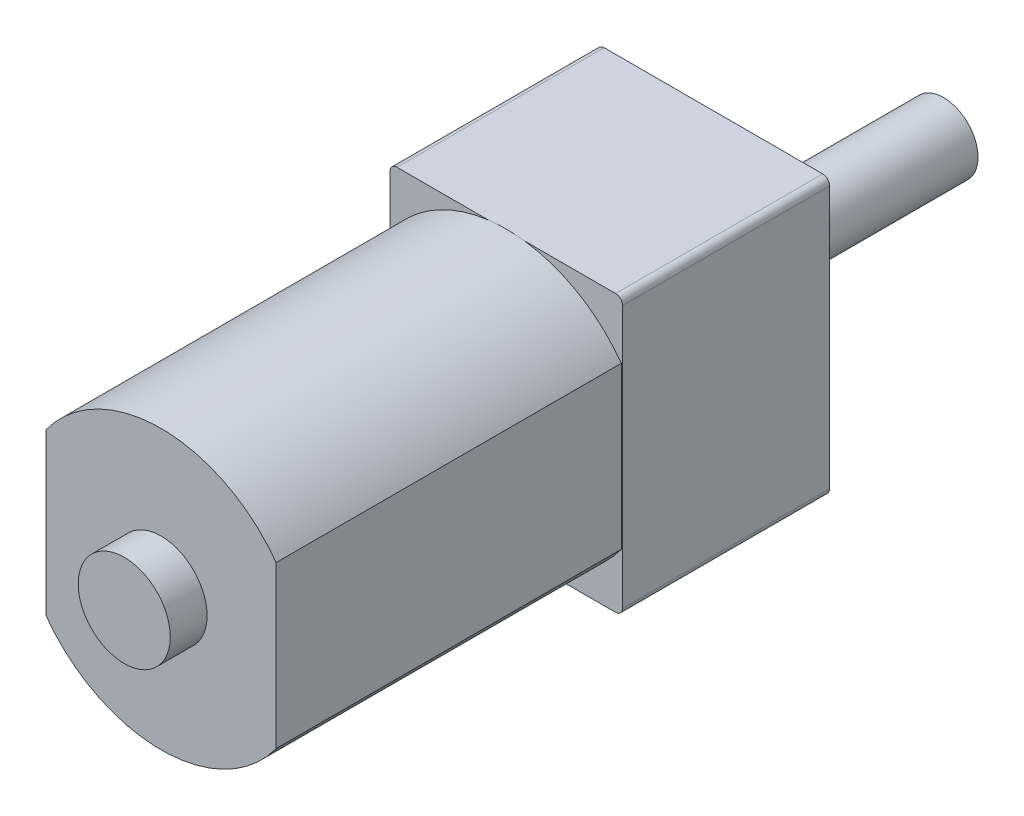
ISO-10303-21;
HEADER;
FILE_DESCRIPTION(('STEP AP214'),'2;1');
FILE_NAME('part.step','',(''),(''),'','','');
FILE_SCHEMA(('AUTOMOTIVE_DESIGN { 1 0 10303 214 1 1 1 1 }'));
ENDSEC;
DATA;
#1=APPLICATION_CONTEXT('core data for automotive mechanical design processes');
#2=APPLICATION_PROTOCOL_DEFINITION('international standard','automotive_design',2000,#1);
#3=PRODUCT_CONTEXT('',#1,'mechanical');
#4=PRODUCT('Part','Part','',(#3));
#5=PRODUCT_RELATED_PRODUCT_CATEGORY('part','',(#4));
#6=PRODUCT_DEFINITION_FORMATION('','',#4);
#7=PRODUCT_DEFINITION_CONTEXT('part definition',#1,'design');
#8=PRODUCT_DEFINITION('design','',#6,#7);
#9=PRODUCT_DEFINITION_SHAPE('','',#8);
#10=(LENGTH_UNIT() NAMED_UNIT(*) SI_UNIT(.MILLI.,.METRE.));
#11=(NAMED_UNIT(*) PLANE_ANGLE_UNIT() SI_UNIT($,.RADIAN.));
#12=(NAMED_UNIT(*) SI_UNIT($,.STERADIAN.) SOLID_ANGLE_UNIT());
#13=UNCERTAINTY_MEASURE_WITH_UNIT(LENGTH_MEASURE(1.E-05),#10,'distance_accuracy_value','');
#14=(GEOMETRIC_REPRESENTATION_CONTEXT(3) GLOBAL_UNCERTAINTY_ASSIGNED_CONTEXT((#13)) GLOBAL_UNIT_ASSIGNED_CONTEXT((#10,
#11,#12)) REPRESENTATION_CONTEXT('',''));
#15=CARTESIAN_POINT('',(0.,0.,0.));
#16=DIRECTION('',(0.,0.,1.));
#17=DIRECTION('',(1.,0.,0.));
#18=AXIS2_PLACEMENT_3D('',#15,#16,#17);
#19=CARTESIAN_POINT('',(0.,-0.126960784313727,0.));
#20=DIRECTION('',(0.,0.,-1.));
#21=DIRECTION('',(-1.,0.,0.));
#22=AXIS2_PLACEMENT_3D('',#19,#20,#21);
#23=PLANE('',#22);
#24=DIRECTION('',(1.,0.,0.));
#25=VECTOR('',#24,1.);
#26=CARTESIAN_POINT('',(-5.05,6.,0.));
#27=LINE('',#26,#25);
#28=CARTESIAN_POINT('',(-0.784344362146735,6.,0.));
#29=VERTEX_POINT('',#28);
#30=CARTESIAN_POINT('',(0.784344362146738,6.,0.));
#31=VERTEX_POINT('',#30);
#32=EDGE_CURVE('E159',#29,#31,#27,.T.);
#33=ORIENTED_EDGE('',*,*,#32,.F.);
#34=CARTESIAN_POINT('',(0.,-0.126960784313727,0.));
#35=DIRECTION('',(0.,0.,1.));
#36=DIRECTION('',(-1.,0.,0.));
#37=AXIS2_PLACEMENT_3D('',#34,#35,#36);
#38=CIRCLE('',#37,6.17696078431373);
#39=EDGE_CURVE('E217',#31,#29,#38,.T.);
#40=ORIENTED_EDGE('',*,*,#39,.F.);
#41=EDGE_LOOP('',(#33,#40));
#42=FACE_BOUND('',#41,.T.);
#43=ADVANCED_FACE('F38',(#42),#23,.T.);
#44=CARTESIAN_POINT('',(0.,-0.126960784313727,15.));
#45=DIRECTION('',(0.,0.,-1.));
#46=DIRECTION('',(-1.,0.,0.));
#47=AXIS2_PLACEMENT_3D('',#44,#45,#46);
#48=CYLINDRICAL_SURFACE('',#47,6.17696078431373);
#49=CARTESIAN_POINT('',(5.,3.5,0.));
#50=VERTEX_POINT('',#49);
#51=EDGE_CURVE('E213',#50,#31,#38,.T.);
#52=ORIENTED_EDGE('',*,*,#51,.T.);
#53=ORIENTED_EDGE('',*,*,#39,.T.);
#54=CARTESIAN_POINT('',(-5.,3.5,0.));
#55=VERTEX_POINT('',#54);
#56=EDGE_CURVE('E193',#29,#55,#38,.T.);
#57=ORIENTED_EDGE('',*,*,#56,.T.);
#58=DIRECTION('',(0.,0.,-1.));
#59=VECTOR('',#58,1.);
#60=CARTESIAN_POINT('',(-5.,3.5,15.));
#61=LINE('',#60,#59);
#62=CARTESIAN_POINT('',(-5.,3.5,15.));
#63=VERTEX_POINT('',#62);
#64=EDGE_CURVE('E232',#63,#55,#61,.T.);
#65=ORIENTED_EDGE('',*,*,#64,.F.);
#66=CARTESIAN_POINT('',(0.,-0.126960784313727,15.));
#67=DIRECTION('',(0.,0.,1.));
#68=DIRECTION('',(-1.,0.,0.));
#69=AXIS2_PLACEMENT_3D('',#66,#67,#68);
#70=CIRCLE('',#69,6.17696078431373);
#71=CARTESIAN_POINT('',(5.,3.5,15.));
#72=VERTEX_POINT('',#71);
#73=EDGE_CURVE('E202',#72,#63,#70,.T.);
#74=ORIENTED_EDGE('',*,*,#73,.F.);
#75=DIRECTION('',(0.,0.,-1.));
#76=VECTOR('',#75,1.);
#77=CARTESIAN_POINT('',(5.,3.5,15.));
#78=LINE('',#77,#76);
#79=EDGE_CURVE('E212',#72,#50,#78,.T.);
#80=ORIENTED_EDGE('',*,*,#79,.T.);
#81=EDGE_LOOP('',(#52,#53,#57,#65,#74,#80));
#82=FACE_BOUND('',#81,.T.);
#83=ADVANCED_FACE('F278',(#82),#48,.T.);
#84=CARTESIAN_POINT('',(-5.,-3.5,15.));
#85=DIRECTION('',(1.,0.,0.));
#86=DIRECTION('',(0.,1.,0.));
#87=AXIS2_PLACEMENT_3D('',#84,#85,#86);
#88=PLANE('',#87);
#89=DIRECTION('',(0.,-1.,0.));
#90=VECTOR('',#89,1.);
#91=CARTESIAN_POINT('',(-5.,-3.5,0.));
#92=LINE('',#91,#90);
#93=CARTESIAN_POINT('',(-5.,-3.5,0.));
#94=VERTEX_POINT('',#93);
#95=EDGE_CURVE('E216',#55,#94,#92,.T.);
#96=ORIENTED_EDGE('',*,*,#95,.T.);
#97=DIRECTION('',(0.,0.,-1.));
#98=VECTOR('',#97,1.);
#99=CARTESIAN_POINT('',(-5.,-3.5,15.));
#100=LINE('',#99,#98);
#101=CARTESIAN_POINT('',(-5.,-3.5,15.));
#102=VERTEX_POINT('',#101);
#103=EDGE_CURVE('E229',#102,#94,#100,.T.);
#104=ORIENTED_EDGE('',*,*,#103,.F.);
#105=DIRECTION('',(0.,-1.,0.));
#106=VECTOR('',#105,1.);
#107=CARTESIAN_POINT('',(-5.,-3.5,15.));
#108=LINE('',#107,#106);
#109=EDGE_CURVE('E205',#63,#102,#108,.T.);
#110=ORIENTED_EDGE('',*,*,#109,.F.);
#111=ORIENTED_EDGE('',*,*,#64,.T.);
#112=EDGE_LOOP('',(#96,#104,#110,#111));
#113=FACE_BOUND('',#112,.T.);
#114=ADVANCED_FACE('F324',(#113),#88,.F.);
#115=CARTESIAN_POINT('',(0.,0.126960784313726,15.));
#116=DIRECTION('',(0.,0.,-1.));
#117=DIRECTION('',(-1.,0.,0.));
#118=AXIS2_PLACEMENT_3D('',#115,#116,#117);
#119=CYLINDRICAL_SURFACE('',#118,6.17696078431373);
#120=CARTESIAN_POINT('',(0.,0.126960784313726,0.));
#121=DIRECTION('',(0.,0.,1.));
#122=DIRECTION('',(-1.,0.,0.));
#123=AXIS2_PLACEMENT_3D('',#120,#121,#122);
#124=CIRCLE('',#123,6.17696078431373);
#125=CARTESIAN_POINT('',(-0.784344362146725,-6.,0.));
#126=VERTEX_POINT('',#125);
#127=EDGE_CURVE('E220',#94,#126,#124,.T.);
#128=ORIENTED_EDGE('',*,*,#127,.T.);
#129=CARTESIAN_POINT('',(0.784344362146723,-6.,0.));
#130=VERTEX_POINT('',#129);
#131=EDGE_CURVE('E222',#126,#130,#124,.T.);
#132=ORIENTED_EDGE('',*,*,#131,.T.);
#133=CARTESIAN_POINT('',(5.,-3.5,0.));
#134=VERTEX_POINT('',#133);
#135=EDGE_CURVE('E219',#130,#134,#124,.T.);
#136=ORIENTED_EDGE('',*,*,#135,.T.);
#137=DIRECTION('',(0.,0.,-1.));
#138=VECTOR('',#137,1.);
#139=CARTESIAN_POINT('',(5.,-3.5,15.));
#140=LINE('',#139,#138);
#141=CARTESIAN_POINT('',(5.,-3.5,15.));
#142=VERTEX_POINT('',#141);
#143=EDGE_CURVE('E226',#142,#134,#140,.T.);
#144=ORIENTED_EDGE('',*,*,#143,.F.);
#145=CARTESIAN_POINT('',(0.,0.126960784313726,15.));
#146=DIRECTION('',(0.,0.,1.));
#147=DIRECTION('',(-1.,0.,0.));
#148=AXIS2_PLACEMENT_3D('',#145,#146,#147);
#149=CIRCLE('',#148,6.17696078431373);
#150=EDGE_CURVE('E208',#102,#142,#149,.T.);
#151=ORIENTED_EDGE('',*,*,#150,.F.);
#152=ORIENTED_EDGE('',*,*,#103,.T.);
#153=EDGE_LOOP('',(#128,#132,#136,#144,#151,#152));
#154=FACE_BOUND('',#153,.T.);
#155=ADVANCED_FACE('F344',(#154),#119,.T.);
#156=CARTESIAN_POINT('',(5.,-3.5,15.));
#157=DIRECTION('',(-1.,0.,0.));
#158=DIRECTION('',(0.,-1.,0.));
#159=AXIS2_PLACEMENT_3D('',#156,#157,#158);
#160=PLANE('',#159);
#161=DIRECTION('',(0.,1.,0.));
#162=VECTOR('',#161,1.);
#163=CARTESIAN_POINT('',(5.,-3.5,0.));
#164=LINE('',#163,#162);
#165=EDGE_CURVE('E206',#134,#50,#164,.T.);
#166=ORIENTED_EDGE('',*,*,#165,.T.);
#167=ORIENTED_EDGE('',*,*,#79,.F.);
#168=DIRECTION('',(0.,1.,0.));
#169=VECTOR('',#168,1.);
#170=CARTESIAN_POINT('',(5.,-3.5,15.));
#171=LINE('',#170,#169);
#172=EDGE_CURVE('E210',#142,#72,#171,.T.);
#173=ORIENTED_EDGE('',*,*,#172,.F.);
#174=ORIENTED_EDGE('',*,*,#143,.T.);
#175=EDGE_LOOP('',(#166,#167,#173,#174));
#176=FACE_BOUND('',#175,.T.);
#177=ADVANCED_FACE('F337',(#176),#160,.F.);
#178=CARTESIAN_POINT('',(0.,-0.126960784313727,15.));
#179=DIRECTION('',(0.,0.,-1.));
#180=DIRECTION('',(-1.,0.,0.));
#181=AXIS2_PLACEMENT_3D('',#178,#179,#180);
#182=PLANE('',#181);
#183=CARTESIAN_POINT('',(0.,0.,15.));
#184=DIRECTION('',(0.,0.,1.));
#185=DIRECTION('',(1.,0.,0.));
#186=AXIS2_PLACEMENT_3D('',#183,#184,#185);
#187=CIRCLE('',#186,2.);
#188=CARTESIAN_POINT('',(2.,0.,15.));
#189=VERTEX_POINT('',#188);
#190=EDGE_CURVE('E158',#189,#189,#187,.T.);
#191=ORIENTED_EDGE('',*,*,#190,.F.);
#192=EDGE_LOOP('',(#191));
#193=FACE_BOUND('',#192,.T.);
#194=ORIENTED_EDGE('',*,*,#73,.T.);
#195=ORIENTED_EDGE('',*,*,#109,.T.);
#196=ORIENTED_EDGE('',*,*,#150,.T.);
#197=ORIENTED_EDGE('',*,*,#172,.T.);
#198=EDGE_LOOP('',(#194,#195,#196,#197));
#199=FACE_BOUND('',#198,.T.);
#200=ADVANCED_FACE('F330',(#193,#199),#182,.F.);
#201=DIRECTION('',(-1.,0.,0.));
#202=VECTOR('',#201,1.);
#203=CARTESIAN_POINT('',(-5.05,-6.,0.));
#204=LINE('',#203,#202);
#205=EDGE_CURVE('E198',#130,#126,#204,.T.);
#206=ORIENTED_EDGE('',*,*,#205,.F.);
#207=ORIENTED_EDGE('',*,*,#131,.F.);
#208=EDGE_LOOP('',(#206,#207));
#209=FACE_BOUND('',#208,.T.);
#210=ADVANCED_FACE('F320',(#209),#23,.T.);
#211=CARTESIAN_POINT('',(0.,0.,0.));
#212=DIRECTION('',(0.,0.,-1.));
#213=DIRECTION('',(-1.,0.,0.));
#214=AXIS2_PLACEMENT_3D('',#211,#212,#213);
#215=PLANE('',#214);
#216=CARTESIAN_POINT('',(4.75,-6.,0.));
#217=VERTEX_POINT('',#216);
#218=EDGE_CURVE('E195',#217,#130,#204,.T.);
#219=ORIENTED_EDGE('',*,*,#218,.F.);
#220=CARTESIAN_POINT('',(4.75,-5.7,0.));
#221=DIRECTION('',(0.,0.,-1.));
#222=DIRECTION('',(-1.,0.,0.));
#223=AXIS2_PLACEMENT_3D('',#220,#221,#222);
#224=CIRCLE('',#223,0.3);
#225=CARTESIAN_POINT('',(5.05,-5.7,0.));
#226=VERTEX_POINT('',#225);
#227=EDGE_CURVE('E242',#217,#226,#224,.F.);
#228=ORIENTED_EDGE('',*,*,#227,.T.);
#229=DIRECTION('',(0.,-1.,0.));
#230=VECTOR('',#229,1.);
#231=CARTESIAN_POINT('',(5.05,-6.,0.));
#232=LINE('',#231,#230);
#233=CARTESIAN_POINT('',(5.05,5.7,0.));
#234=VERTEX_POINT('',#233);
#235=EDGE_CURVE('E173',#234,#226,#232,.T.);
#236=ORIENTED_EDGE('',*,*,#235,.F.);
#237=CARTESIAN_POINT('',(4.75,5.7,0.));
#238=DIRECTION('',(0.,0.,-1.));
#239=DIRECTION('',(-1.,0.,0.));
#240=AXIS2_PLACEMENT_3D('',#237,#238,#239);
#241=CIRCLE('',#240,0.3);
#242=CARTESIAN_POINT('',(4.75,6.,0.));
#243=VERTEX_POINT('',#242);
#244=EDGE_CURVE('E240',#234,#243,#241,.F.);
#245=ORIENTED_EDGE('',*,*,#244,.T.);
#246=EDGE_CURVE('E200',#31,#243,#27,.T.);
#247=ORIENTED_EDGE('',*,*,#246,.F.);
#248=ORIENTED_EDGE('',*,*,#51,.F.);
#249=ORIENTED_EDGE('',*,*,#165,.F.);
#250=ORIENTED_EDGE('',*,*,#135,.F.);
#251=EDGE_LOOP('',(#219,#228,#236,#245,#247,#248,#249,#250));
#252=FACE_BOUND('',#251,.T.);
#253=ADVANCED_FACE('F329',(#252),#215,.F.);
#254=CARTESIAN_POINT('',(5.05,-6.,-9.));
#255=DIRECTION('',(-1.,0.,0.));
#256=DIRECTION('',(0.,0.,1.));
#257=AXIS2_PLACEMENT_3D('',#254,#255,#256);
#258=PLANE('',#257);
#259=ORIENTED_EDGE('',*,*,#235,.T.);
#260=DIRECTION('',(0.,0.,1.));
#261=VECTOR('',#260,1.);
#262=CARTESIAN_POINT('',(5.05,-5.7,-9.));
#263=LINE('',#262,#261);
#264=CARTESIAN_POINT('',(5.05,-5.7,-9.));
#265=VERTEX_POINT('',#264);
#266=EDGE_CURVE('E247',#226,#265,#263,.F.);
#267=ORIENTED_EDGE('',*,*,#266,.T.);
#268=DIRECTION('',(0.,-1.,0.));
#269=VECTOR('',#268,1.);
#270=CARTESIAN_POINT('',(5.05,-6.,-9.));
#271=LINE('',#270,#269);
#272=CARTESIAN_POINT('',(5.05,5.7,-9.));
#273=VERTEX_POINT('',#272);
#274=EDGE_CURVE('E181',#273,#265,#271,.T.);
#275=ORIENTED_EDGE('',*,*,#274,.F.);
#276=DIRECTION('',(0.,0.,1.));
#277=VECTOR('',#276,1.);
#278=CARTESIAN_POINT('',(5.05,5.7,-9.));
#279=LINE('',#278,#277);
#280=EDGE_CURVE('E244',#273,#234,#279,.T.);
#281=ORIENTED_EDGE('',*,*,#280,.T.);
#282=EDGE_LOOP('',(#259,#267,#275,#281));
#283=FACE_BOUND('',#282,.T.);
#284=ADVANCED_FACE('F294',(#283),#258,.F.);
#285=CARTESIAN_POINT('',(-5.05,-6.,-9.));
#286=DIRECTION('',(0.,1.,0.));
#287=DIRECTION('',(-1.,0.,0.));
#288=AXIS2_PLACEMENT_3D('',#285,#286,#287);
#289=PLANE('',#288);
#290=DIRECTION('',(-1.,0.,0.));
#291=VECTOR('',#290,1.);
#292=CARTESIAN_POINT('',(-5.05,-6.,-9.));
#293=LINE('',#292,#291);
#294=CARTESIAN_POINT('',(4.75,-6.,-9.));
#295=VERTEX_POINT('',#294);
#296=CARTESIAN_POINT('',(-4.75,-6.,-9.));
#297=VERTEX_POINT('',#296);
#298=EDGE_CURVE('E184',#295,#297,#293,.T.);
#299=ORIENTED_EDGE('',*,*,#298,.F.);
#300=DIRECTION('',(0.,0.,1.));
#301=VECTOR('',#300,1.);
#302=CARTESIAN_POINT('',(4.75,-6.,-9.));
#303=LINE('',#302,#301);
#304=EDGE_CURVE('E237',#295,#217,#303,.T.);
#305=ORIENTED_EDGE('',*,*,#304,.T.);
#306=ORIENTED_EDGE('',*,*,#218,.T.);
#307=ORIENTED_EDGE('',*,*,#205,.T.);
#308=CARTESIAN_POINT('',(-4.75,-6.,0.));
#309=VERTEX_POINT('',#308);
#310=EDGE_CURVE('E176',#126,#309,#204,.T.);
#311=ORIENTED_EDGE('',*,*,#310,.T.);
#312=DIRECTION('',(0.,0.,1.));
#313=VECTOR('',#312,1.);
#314=CARTESIAN_POINT('',(-4.75,-6.,-9.));
#315=LINE('',#314,#313);
#316=EDGE_CURVE('E235',#309,#297,#315,.F.);
#317=ORIENTED_EDGE('',*,*,#316,.T.);
#318=EDGE_LOOP('',(#299,#305,#306,#307,#311,#317));
#319=FACE_BOUND('',#318,.T.);
#320=ADVANCED_FACE('F303',(#319),#289,.F.);
#321=CARTESIAN_POINT('',(-5.05,-6.,-9.));
#322=DIRECTION('',(1.,0.,0.));
#323=DIRECTION('',(0.,0.,-1.));
#324=AXIS2_PLACEMENT_3D('',#321,#322,#323);
#325=PLANE('',#324);
#326=DIRECTION('',(0.,1.,0.));
#327=VECTOR('',#326,1.);
#328=CARTESIAN_POINT('',(-5.05,-6.,-9.));
#329=LINE('',#328,#327);
#330=CARTESIAN_POINT('',(-5.05,-5.7,-9.));
#331=VERTEX_POINT('',#330);
#332=CARTESIAN_POINT('',(-5.05,5.7,-9.));
#333=VERTEX_POINT('',#332);
#334=EDGE_CURVE('E188',#331,#333,#329,.T.);
#335=ORIENTED_EDGE('',*,*,#334,.F.);
#336=DIRECTION('',(0.,0.,1.));
#337=VECTOR('',#336,1.);
#338=CARTESIAN_POINT('',(-5.05,-5.7,-9.));
#339=LINE('',#338,#337);
#340=CARTESIAN_POINT('',(-5.05,-5.7,0.));
#341=VERTEX_POINT('',#340);
#342=EDGE_CURVE('E259',#331,#341,#339,.T.);
#343=ORIENTED_EDGE('',*,*,#342,.T.);
#344=DIRECTION('',(0.,1.,0.));
#345=VECTOR('',#344,1.);
#346=CARTESIAN_POINT('',(-5.05,-6.,0.));
#347=LINE('',#346,#345);
#348=CARTESIAN_POINT('',(-5.05,5.7,0.));
#349=VERTEX_POINT('',#348);
#350=EDGE_CURVE('E197',#341,#349,#347,.T.);
#351=ORIENTED_EDGE('',*,*,#350,.T.);
#352=DIRECTION('',(0.,0.,1.));
#353=VECTOR('',#352,1.);
#354=CARTESIAN_POINT('',(-5.05,5.7,-9.));
#355=LINE('',#354,#353);
#356=EDGE_CURVE('E257',#349,#333,#355,.F.);
#357=ORIENTED_EDGE('',*,*,#356,.T.);
#358=EDGE_LOOP('',(#335,#343,#351,#357));
#359=FACE_BOUND('',#358,.T.);
#360=ADVANCED_FACE('F313',(#359),#325,.F.);
#361=CARTESIAN_POINT('',(-5.05,6.,-9.));
#362=DIRECTION('',(0.,-1.,0.));
#363=DIRECTION('',(1.,0.,0.));
#364=AXIS2_PLACEMENT_3D('',#361,#362,#363);
#365=PLANE('',#364);
#366=ORIENTED_EDGE('',*,*,#246,.T.);
#367=DIRECTION('',(0.,0.,1.));
#368=VECTOR('',#367,1.);
#369=CARTESIAN_POINT('',(4.75,6.,-9.));
#370=LINE('',#369,#368);
#371=CARTESIAN_POINT('',(4.75,6.,-9.));
#372=VERTEX_POINT('',#371);
#373=EDGE_CURVE('E11',#243,#372,#370,.F.);
#374=ORIENTED_EDGE('',*,*,#373,.T.);
#375=DIRECTION('',(1.,0.,0.));
#376=VECTOR('',#375,1.);
#377=CARTESIAN_POINT('',(-5.05,6.,-9.));
#378=LINE('',#377,#376);
#379=CARTESIAN_POINT('',(-4.75,6.,-9.));
#380=VERTEX_POINT('',#379);
#381=EDGE_CURVE('E191',#380,#372,#378,.T.);
#382=ORIENTED_EDGE('',*,*,#381,.F.);
#383=DIRECTION('',(0.,0.,1.));
#384=VECTOR('',#383,1.);
#385=CARTESIAN_POINT('',(-4.75,6.,-9.));
#386=LINE('',#385,#384);
#387=CARTESIAN_POINT('',(-4.75,6.,0.));
#388=VERTEX_POINT('',#387);
#389=EDGE_CURVE('E46',#380,#388,#386,.T.);
#390=ORIENTED_EDGE('',*,*,#389,.T.);
#391=EDGE_CURVE('E185',#388,#29,#27,.T.);
#392=ORIENTED_EDGE('',*,*,#391,.T.);
#393=ORIENTED_EDGE('',*,*,#32,.T.);
#394=EDGE_LOOP('',(#366,#374,#382,#390,#392,#393));
#395=FACE_BOUND('',#394,.T.);
#396=ADVANCED_FACE('F267',(#395),#365,.F.);
#397=CARTESIAN_POINT('',(0.,0.,-9.));
#398=DIRECTION('',(0.,0.,-1.));
#399=DIRECTION('',(-1.,0.,0.));
#400=AXIS2_PLACEMENT_3D('',#397,#398,#399);
#401=PLANE('',#400);
#402=CARTESIAN_POINT('',(0.,0.,-9.));
#403=DIRECTION('',(0.,0.,-1.));
#404=DIRECTION('',(-1.,0.,0.));
#405=AXIS2_PLACEMENT_3D('',#402,#403,#404);
#406=CIRCLE('',#405,2.);
#407=CARTESIAN_POINT('',(-2.,0.,-9.));
#408=VERTEX_POINT('',#407);
#409=EDGE_CURVE('E597',#408,#408,#406,.T.);
#410=ORIENTED_EDGE('',*,*,#409,.F.);
#411=EDGE_LOOP('',(#410));
#412=FACE_BOUND('',#411,.T.);
#413=ORIENTED_EDGE('',*,*,#274,.T.);
#414=CARTESIAN_POINT('',(4.75,-5.7,-9.));
#415=DIRECTION('',(0.,0.,-1.));
#416=DIRECTION('',(-1.,0.,0.));
#417=AXIS2_PLACEMENT_3D('',#414,#415,#416);
#418=CIRCLE('',#417,0.3);
#419=EDGE_CURVE('E255',#265,#295,#418,.T.);
#420=ORIENTED_EDGE('',*,*,#419,.T.);
#421=ORIENTED_EDGE('',*,*,#298,.T.);
#422=CARTESIAN_POINT('',(-4.75,-5.7,-9.));
#423=DIRECTION('',(0.,0.,-1.));
#424=DIRECTION('',(-1.,0.,0.));
#425=AXIS2_PLACEMENT_3D('',#422,#423,#424);
#426=CIRCLE('',#425,0.3);
#427=EDGE_CURVE('E253',#297,#331,#426,.T.);
#428=ORIENTED_EDGE('',*,*,#427,.T.);
#429=ORIENTED_EDGE('',*,*,#334,.T.);
#430=CARTESIAN_POINT('',(-4.75,5.7,-9.));
#431=DIRECTION('',(0.,0.,-1.));
#432=DIRECTION('',(-1.,0.,0.));
#433=AXIS2_PLACEMENT_3D('',#430,#431,#432);
#434=CIRCLE('',#433,0.3);
#435=EDGE_CURVE('E249',#333,#380,#434,.T.);
#436=ORIENTED_EDGE('',*,*,#435,.T.);
#437=ORIENTED_EDGE('',*,*,#381,.T.);
#438=CARTESIAN_POINT('',(4.75,5.7,-9.));
#439=DIRECTION('',(0.,0.,-1.));
#440=DIRECTION('',(-1.,0.,0.));
#441=AXIS2_PLACEMENT_3D('',#438,#439,#440);
#442=CIRCLE('',#441,0.3);
#443=EDGE_CURVE('E251',#372,#273,#442,.T.);
#444=ORIENTED_EDGE('',*,*,#443,.T.);
#445=EDGE_LOOP('',(#413,#420,#421,#428,#429,#436,#437,#444));
#446=FACE_BOUND('',#445,.T.);
#447=ADVANCED_FACE('F291',(#412,#446),#401,.T.);
#448=ORIENTED_EDGE('',*,*,#350,.F.);
#449=CARTESIAN_POINT('',(-4.75,-5.7,0.));
#450=DIRECTION('',(0.,0.,-1.));
#451=DIRECTION('',(-1.,0.,0.));
#452=AXIS2_PLACEMENT_3D('',#449,#450,#451);
#453=CIRCLE('',#452,0.3);
#454=EDGE_CURVE('E263',#341,#309,#453,.F.);
#455=ORIENTED_EDGE('',*,*,#454,.T.);
#456=ORIENTED_EDGE('',*,*,#310,.F.);
#457=ORIENTED_EDGE('',*,*,#127,.F.);
#458=ORIENTED_EDGE('',*,*,#95,.F.);
#459=ORIENTED_EDGE('',*,*,#56,.F.);
#460=ORIENTED_EDGE('',*,*,#391,.F.);
#461=CARTESIAN_POINT('',(-4.75,5.7,0.));
#462=DIRECTION('',(0.,0.,-1.));
#463=DIRECTION('',(-1.,0.,0.));
#464=AXIS2_PLACEMENT_3D('',#461,#462,#463);
#465=CIRCLE('',#464,0.3);
#466=EDGE_CURVE('E53',#388,#349,#465,.F.);
#467=ORIENTED_EDGE('',*,*,#466,.T.);
#468=EDGE_LOOP('',(#448,#455,#456,#457,#458,#459,#460,#467));
#469=FACE_BOUND('',#468,.T.);
#470=ADVANCED_FACE('F272',(#469),#215,.F.);
#471=CARTESIAN_POINT('',(0.,0.,-10.));
#472=DIRECTION('',(0.,0.,-1.));
#473=DIRECTION('',(-1.,0.,0.));
#474=AXIS2_PLACEMENT_3D('',#471,#472,#473);
#475=PLANE('',#474);
#476=CARTESIAN_POINT('',(0.,0.,-10.));
#477=DIRECTION('',(0.,0.,-1.));
#478=DIRECTION('',(-1.,0.,0.));
#479=AXIS2_PLACEMENT_3D('',#476,#477,#478);
#480=CIRCLE('',#479,2.);
#481=CARTESIAN_POINT('',(-2.,0.,-10.));
#482=VERTEX_POINT('',#481);
#483=EDGE_CURVE('E168',#482,#482,#480,.T.);
#484=ORIENTED_EDGE('',*,*,#483,.T.);
#485=EDGE_LOOP('',(#484));
#486=FACE_BOUND('',#485,.T.);
#487=CARTESIAN_POINT('',(0.,0.,-10.));
#488=DIRECTION('',(0.,0.,-1.));
#489=DIRECTION('',(-1.,0.,0.));
#490=AXIS2_PLACEMENT_3D('',#487,#488,#489);
#491=CIRCLE('',#490,1.5);
#492=CARTESIAN_POINT('',(-1.,1.11803398874989,-10.));
#493=VERTEX_POINT('',#492);
#494=CARTESIAN_POINT('',(-1.,-1.11803398874989,-10.));
#495=VERTEX_POINT('',#494);
#496=EDGE_CURVE('E153',#493,#495,#491,.T.);
#497=ORIENTED_EDGE('',*,*,#496,.F.);
#498=DIRECTION('',(0.,1.,0.));
#499=VECTOR('',#498,1.);
#500=CARTESIAN_POINT('',(-1.,-1.11803398874989,-10.));
#501=LINE('',#500,#499);
#502=EDGE_CURVE('E150',#495,#493,#501,.T.);
#503=ORIENTED_EDGE('',*,*,#502,.F.);
#504=EDGE_LOOP('',(#497,#503));
#505=FACE_BOUND('',#504,.T.);
#506=ADVANCED_FACE('F152',(#486,#505),#475,.T.);
#507=CARTESIAN_POINT('',(0.,0.,-10.));
#508=DIRECTION('',(0.,0.,1.));
#509=DIRECTION('',(1.,0.,0.));
#510=AXIS2_PLACEMENT_3D('',#507,#508,#509);
#511=CYLINDRICAL_SURFACE('',#510,2.);
#512=ORIENTED_EDGE('',*,*,#483,.F.);
#513=EDGE_LOOP('',(#512));
#514=FACE_BOUND('',#513,.T.);
#515=ORIENTED_EDGE('',*,*,#409,.T.);
#516=EDGE_LOOP('',(#515));
#517=FACE_BOUND('',#516,.T.);
#518=ADVANCED_FACE('F416',(#514,#517),#511,.T.);
#519=CARTESIAN_POINT('',(0.,0.,-19.));
#520=DIRECTION('',(0.,0.,-1.));
#521=DIRECTION('',(-1.,0.,0.));
#522=AXIS2_PLACEMENT_3D('',#519,#520,#521);
#523=PLANE('',#522);
#524=CARTESIAN_POINT('',(0.,0.,-19.));
#525=DIRECTION('',(0.,0.,-1.));
#526=DIRECTION('',(-1.,0.,0.));
#527=AXIS2_PLACEMENT_3D('',#524,#525,#526);
#528=CIRCLE('',#527,1.5);
#529=CARTESIAN_POINT('',(-1.,1.11803398874989,-19.));
#530=VERTEX_POINT('',#529);
#531=CARTESIAN_POINT('',(-1.,-1.11803398874989,-19.));
#532=VERTEX_POINT('',#531);
#533=EDGE_CURVE('E167',#530,#532,#528,.T.);
#534=ORIENTED_EDGE('',*,*,#533,.T.);
#535=DIRECTION('',(0.,1.,0.));
#536=VECTOR('',#535,1.);
#537=CARTESIAN_POINT('',(-1.,-1.11803398874989,-19.));
#538=LINE('',#537,#536);
#539=EDGE_CURVE('E171',#532,#530,#538,.T.);
#540=ORIENTED_EDGE('',*,*,#539,.T.);
#541=EDGE_LOOP('',(#534,#540));
#542=FACE_BOUND('',#541,.T.);
#543=ADVANCED_FACE('F420',(#542),#523,.T.);
#544=CARTESIAN_POINT('',(-1.,-1.11803398874989,-19.));
#545=DIRECTION('',(1.,0.,0.));
#546=DIRECTION('',(0.,0.,-1.));
#547=AXIS2_PLACEMENT_3D('',#544,#545,#546);
#548=PLANE('',#547);
#549=DIRECTION('',(0.,0.,1.));
#550=VECTOR('',#549,1.);
#551=CARTESIAN_POINT('',(-1.,-1.11803398874989,-19.));
#552=LINE('',#551,#550);
#553=EDGE_CURVE('E165',#532,#495,#552,.T.);
#554=ORIENTED_EDGE('',*,*,#553,.T.);
#555=ORIENTED_EDGE('',*,*,#502,.T.);
#556=DIRECTION('',(0.,0.,1.));
#557=VECTOR('',#556,1.);
#558=CARTESIAN_POINT('',(-1.,1.11803398874989,-19.));
#559=LINE('',#558,#557);
#560=EDGE_CURVE('E166',#530,#493,#559,.T.);
#561=ORIENTED_EDGE('',*,*,#560,.F.);
#562=ORIENTED_EDGE('',*,*,#539,.F.);
#563=EDGE_LOOP('',(#554,#555,#561,#562));
#564=FACE_BOUND('',#563,.T.);
#565=ADVANCED_FACE('F170',(#564),#548,.F.);
#566=CARTESIAN_POINT('',(0.,0.,-19.));
#567=DIRECTION('',(0.,0.,1.));
#568=DIRECTION('',(1.,0.,0.));
#569=AXIS2_PLACEMENT_3D('',#566,#567,#568);
#570=CYLINDRICAL_SURFACE('',#569,1.5);
#571=ORIENTED_EDGE('',*,*,#560,.T.);
#572=ORIENTED_EDGE('',*,*,#496,.T.);
#573=ORIENTED_EDGE('',*,*,#553,.F.);
#574=ORIENTED_EDGE('',*,*,#533,.F.);
#575=EDGE_LOOP('',(#571,#572,#573,#574));
#576=FACE_BOUND('',#575,.T.);
#577=ADVANCED_FACE('F163',(#576),#570,.T.);
#578=CARTESIAN_POINT('',(0.,0.,16.6));
#579=DIRECTION('',(0.,0.,-1.));
#580=DIRECTION('',(-1.,0.,0.));
#581=AXIS2_PLACEMENT_3D('',#578,#579,#580);
#582=CYLINDRICAL_SURFACE('',#581,2.);
#583=CARTESIAN_POINT('',(0.,0.,16.6));
#584=DIRECTION('',(0.,0.,1.));
#585=DIRECTION('',(1.,0.,0.));
#586=AXIS2_PLACEMENT_3D('',#583,#584,#585);
#587=CIRCLE('',#586,2.);
#588=CARTESIAN_POINT('',(2.,0.,16.6));
#589=VERTEX_POINT('',#588);
#590=EDGE_CURVE('E599',#589,#589,#587,.T.);
#591=ORIENTED_EDGE('',*,*,#590,.F.);
#592=EDGE_LOOP('',(#591));
#593=FACE_BOUND('',#592,.T.);
#594=ORIENTED_EDGE('',*,*,#190,.T.);
#595=EDGE_LOOP('',(#594));
#596=FACE_BOUND('',#595,.T.);
#597=ADVANCED_FACE('F400',(#593,#596),#582,.T.);
#598=CARTESIAN_POINT('',(0.,0.,16.6));
#599=DIRECTION('',(0.,0.,1.));
#600=DIRECTION('',(1.,0.,0.));
#601=AXIS2_PLACEMENT_3D('',#598,#599,#600);
#602=PLANE('',#601);
#603=ORIENTED_EDGE('',*,*,#590,.T.);
#604=EDGE_LOOP('',(#603));
#605=FACE_BOUND('',#604,.T.);
#606=ADVANCED_FACE('F364',(#605),#602,.T.);
#607=CARTESIAN_POINT('',(4.75,-5.7,-9.));
#608=DIRECTION('',(0.,0.,1.));
#609=DIRECTION('',(1.,0.,0.));
#610=AXIS2_PLACEMENT_3D('',#607,#608,#609);
#611=CYLINDRICAL_SURFACE('',#610,0.3);
#612=ORIENTED_EDGE('',*,*,#419,.F.);
#613=ORIENTED_EDGE('',*,*,#266,.F.);
#614=ORIENTED_EDGE('',*,*,#227,.F.);
#615=ORIENTED_EDGE('',*,*,#304,.F.);
#616=EDGE_LOOP('',(#612,#613,#614,#615));
#617=FACE_BOUND('',#616,.T.);
#618=ADVANCED_FACE('F298',(#617),#611,.T.);
#619=CARTESIAN_POINT('',(-4.75,-5.7,-9.));
#620=DIRECTION('',(0.,0.,1.));
#621=DIRECTION('',(1.,0.,0.));
#622=AXIS2_PLACEMENT_3D('',#619,#620,#621);
#623=CYLINDRICAL_SURFACE('',#622,0.3);
#624=ORIENTED_EDGE('',*,*,#427,.F.);
#625=ORIENTED_EDGE('',*,*,#316,.F.);
#626=ORIENTED_EDGE('',*,*,#454,.F.);
#627=ORIENTED_EDGE('',*,*,#342,.F.);
#628=EDGE_LOOP('',(#624,#625,#626,#627));
#629=FACE_BOUND('',#628,.T.);
#630=ADVANCED_FACE('F309',(#629),#623,.T.);
#631=CARTESIAN_POINT('',(4.75,5.7,-9.));
#632=DIRECTION('',(0.,0.,1.));
#633=DIRECTION('',(1.,0.,0.));
#634=AXIS2_PLACEMENT_3D('',#631,#632,#633);
#635=CYLINDRICAL_SURFACE('',#634,0.3);
#636=ORIENTED_EDGE('',*,*,#443,.F.);
#637=ORIENTED_EDGE('',*,*,#373,.F.);
#638=ORIENTED_EDGE('',*,*,#244,.F.);
#639=ORIENTED_EDGE('',*,*,#280,.F.);
#640=EDGE_LOOP('',(#636,#637,#638,#639));
#641=FACE_BOUND('',#640,.T.);
#642=ADVANCED_FACE('F287',(#641),#635,.T.);
#643=CARTESIAN_POINT('',(-4.75,5.7,-9.));
#644=DIRECTION('',(0.,0.,1.));
#645=DIRECTION('',(1.,0.,0.));
#646=AXIS2_PLACEMENT_3D('',#643,#644,#645);
#647=CYLINDRICAL_SURFACE('',#646,0.3);
#648=ORIENTED_EDGE('',*,*,#435,.F.);
#649=ORIENTED_EDGE('',*,*,#356,.F.);
#650=ORIENTED_EDGE('',*,*,#466,.F.);
#651=ORIENTED_EDGE('',*,*,#389,.F.);
#652=EDGE_LOOP('',(#648,#649,#650,#651));
#653=FACE_BOUND('',#652,.T.);
#654=ADVANCED_FACE('F40',(#653),#647,.T.);
#655=CLOSED_SHELL('',(#43,#83,#114,#155,#177,#200,#210,#253,#284,#320,#360,#396,#447,#470,#506,
#518,#543,#565,#577,#597,#606,#618,#630,#642,#654));
#656=MANIFOLD_SOLID_BREP('B2',#655);
#657=ADVANCED_BREP_SHAPE_REPRESENTATION('',(#18,#656),#14);
#658=SHAPE_DEFINITION_REPRESENTATION(#9,#657);
ENDSEC;
END-ISO-10303-21;
